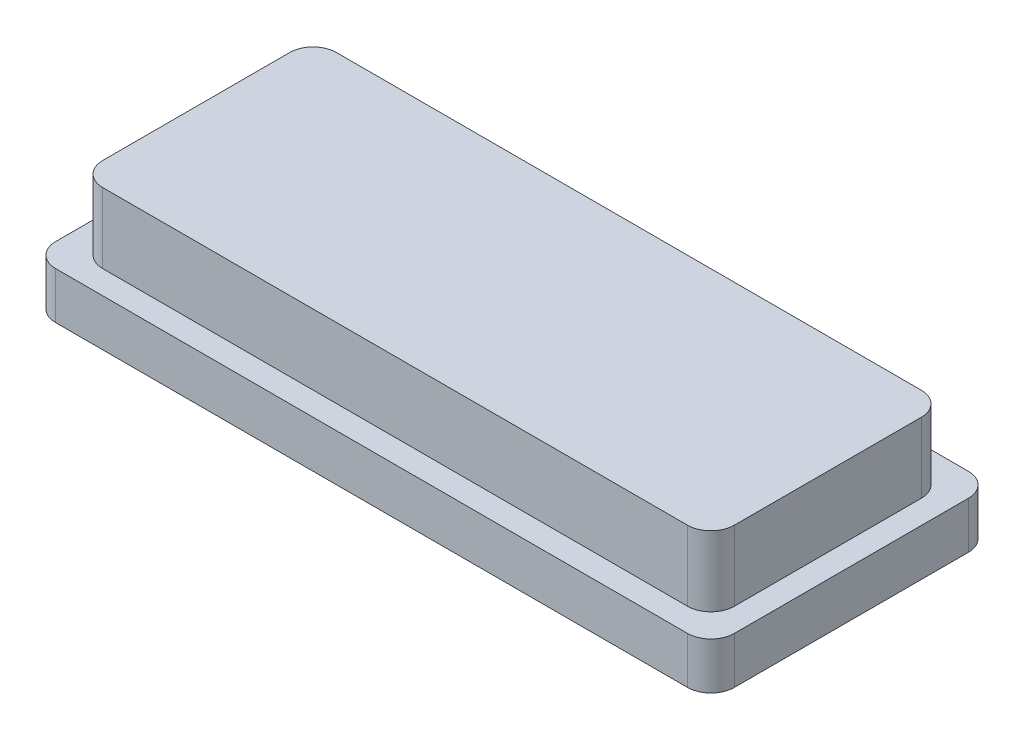
ISO-10303-21;
HEADER;
FILE_DESCRIPTION(('STEP AP214'),'2;1');
FILE_NAME('part.step','',(''),(''),'','','');
FILE_SCHEMA(('AUTOMOTIVE_DESIGN { 1 0 10303 214 1 1 1 1 }'));
ENDSEC;
DATA;
#1=APPLICATION_CONTEXT('core data for automotive mechanical design processes');
#2=APPLICATION_PROTOCOL_DEFINITION('international standard','automotive_design',2000,#1);
#3=PRODUCT_CONTEXT('',#1,'mechanical');
#4=PRODUCT('Part','Part','',(#3));
#5=PRODUCT_RELATED_PRODUCT_CATEGORY('part','',(#4));
#6=PRODUCT_DEFINITION_FORMATION('','',#4);
#7=PRODUCT_DEFINITION_CONTEXT('part definition',#1,'design');
#8=PRODUCT_DEFINITION('design','',#6,#7);
#9=PRODUCT_DEFINITION_SHAPE('','',#8);
#10=(LENGTH_UNIT() NAMED_UNIT(*) SI_UNIT(.MILLI.,.METRE.));
#11=(NAMED_UNIT(*) PLANE_ANGLE_UNIT() SI_UNIT($,.RADIAN.));
#12=(NAMED_UNIT(*) SI_UNIT($,.STERADIAN.) SOLID_ANGLE_UNIT());
#13=UNCERTAINTY_MEASURE_WITH_UNIT(LENGTH_MEASURE(1.E-05),#10,'distance_accuracy_value','');
#14=(GEOMETRIC_REPRESENTATION_CONTEXT(3) GLOBAL_UNCERTAINTY_ASSIGNED_CONTEXT((#13)) GLOBAL_UNIT_ASSIGNED_CONTEXT((#10,
#11,#12)) REPRESENTATION_CONTEXT('',''));
#15=CARTESIAN_POINT('',(0.,0.,0.));
#16=DIRECTION('',(0.,0.,1.));
#17=DIRECTION('',(1.,0.,0.));
#18=AXIS2_PLACEMENT_3D('',#15,#16,#17);
#19=CARTESIAN_POINT('',(13.5,2.,-5.));
#20=DIRECTION('',(0.,1.,0.));
#21=DIRECTION('',(0.,0.,1.));
#22=AXIS2_PLACEMENT_3D('',#19,#20,#21);
#23=PLANE('',#22);
#24=CARTESIAN_POINT('',(13.5,2.,-5.));
#25=DIRECTION('',(0.,1.,0.));
#26=DIRECTION('',(0.,0.,1.));
#27=AXIS2_PLACEMENT_3D('',#24,#25,#26);
#28=CIRCLE('',#27,1.);
#29=CARTESIAN_POINT('',(14.5,2.,-4.99999999999999));
#30=VERTEX_POINT('',#29);
#31=CARTESIAN_POINT('',(13.5,2.,-6.));
#32=VERTEX_POINT('',#31);
#33=EDGE_CURVE('E216',#30,#32,#28,.T.);
#34=ORIENTED_EDGE('',*,*,#33,.T.);
#35=DIRECTION('',(-1.,0.,0.));
#36=VECTOR('',#35,1.);
#37=CARTESIAN_POINT('',(-13.5,2.,-6.));
#38=LINE('',#37,#36);
#39=CARTESIAN_POINT('',(-13.5,2.,-6.));
#40=VERTEX_POINT('',#39);
#41=EDGE_CURVE('E219',#32,#40,#38,.T.);
#42=ORIENTED_EDGE('',*,*,#41,.T.);
#43=CARTESIAN_POINT('',(-13.5,2.,-5.));
#44=DIRECTION('',(0.,1.,0.));
#45=DIRECTION('',(0.,0.,-1.));
#46=AXIS2_PLACEMENT_3D('',#43,#44,#45);
#47=CIRCLE('',#46,1.);
#48=CARTESIAN_POINT('',(-14.5,2.,-4.99999999999999));
#49=VERTEX_POINT('',#48);
#50=EDGE_CURVE('E222',#40,#49,#47,.T.);
#51=ORIENTED_EDGE('',*,*,#50,.T.);
#52=DIRECTION('',(0.,0.,1.));
#53=VECTOR('',#52,1.);
#54=CARTESIAN_POINT('',(-14.5,2.,-4.99999999999999));
#55=LINE('',#54,#53);
#56=CARTESIAN_POINT('',(-14.5,2.,4.99999999999999));
#57=VERTEX_POINT('',#56);
#58=EDGE_CURVE('E224',#49,#57,#55,.T.);
#59=ORIENTED_EDGE('',*,*,#58,.T.);
#60=CARTESIAN_POINT('',(-13.5,2.,5.));
#61=DIRECTION('',(0.,1.,0.));
#62=DIRECTION('',(0.,0.,-1.));
#63=AXIS2_PLACEMENT_3D('',#60,#61,#62);
#64=CIRCLE('',#63,1.);
#65=CARTESIAN_POINT('',(-13.5,2.,6.));
#66=VERTEX_POINT('',#65);
#67=EDGE_CURVE('E226',#57,#66,#64,.T.);
#68=ORIENTED_EDGE('',*,*,#67,.T.);
#69=DIRECTION('',(1.,0.,0.));
#70=VECTOR('',#69,1.);
#71=CARTESIAN_POINT('',(-13.5,2.,6.));
#72=LINE('',#71,#70);
#73=CARTESIAN_POINT('',(13.5,2.,6.));
#74=VERTEX_POINT('',#73);
#75=EDGE_CURVE('E228',#66,#74,#72,.T.);
#76=ORIENTED_EDGE('',*,*,#75,.T.);
#77=CARTESIAN_POINT('',(13.5,2.,5.));
#78=DIRECTION('',(0.,1.,0.));
#79=DIRECTION('',(0.,0.,1.));
#80=AXIS2_PLACEMENT_3D('',#77,#78,#79);
#81=CIRCLE('',#80,1.);
#82=CARTESIAN_POINT('',(14.5,2.,4.99999999999999));
#83=VERTEX_POINT('',#82);
#84=EDGE_CURVE('E230',#74,#83,#81,.T.);
#85=ORIENTED_EDGE('',*,*,#84,.T.);
#86=DIRECTION('',(0.,0.,-1.));
#87=VECTOR('',#86,1.);
#88=CARTESIAN_POINT('',(14.5,2.,-4.99999999999999));
#89=LINE('',#88,#87);
#90=EDGE_CURVE('E232',#83,#30,#89,.T.);
#91=ORIENTED_EDGE('',*,*,#90,.T.);
#92=EDGE_LOOP('',(#34,#42,#51,#59,#68,#76,#85,#91));
#93=FACE_BOUND('',#92,.T.);
#94=CARTESIAN_POINT('',(12.495,2.,-3.995));
#95=DIRECTION('',(0.,1.,0.));
#96=DIRECTION('',(0.,0.,1.));
#97=AXIS2_PLACEMENT_3D('',#94,#95,#96);
#98=CIRCLE('',#97,1.);
#99=CARTESIAN_POINT('',(13.495,2.,-3.99499999999999));
#100=VERTEX_POINT('',#99);
#101=CARTESIAN_POINT('',(12.495,2.,-4.995));
#102=VERTEX_POINT('',#101);
#103=EDGE_CURVE('E167',#100,#102,#98,.T.);
#104=ORIENTED_EDGE('',*,*,#103,.F.);
#105=DIRECTION('',(0.,0.,1.));
#106=VECTOR('',#105,1.);
#107=CARTESIAN_POINT('',(13.495,2.,-3.99499999999999));
#108=LINE('',#107,#106);
#109=CARTESIAN_POINT('',(13.495,2.,3.99499999999999));
#110=VERTEX_POINT('',#109);
#111=EDGE_CURVE('E48',#100,#110,#108,.T.);
#112=ORIENTED_EDGE('',*,*,#111,.T.);
#113=CARTESIAN_POINT('',(12.495,2.,3.995));
#114=DIRECTION('',(0.,1.,0.));
#115=DIRECTION('',(0.,0.,1.));
#116=AXIS2_PLACEMENT_3D('',#113,#114,#115);
#117=CIRCLE('',#116,1.);
#118=CARTESIAN_POINT('',(12.495,2.,4.995));
#119=VERTEX_POINT('',#118);
#120=EDGE_CURVE('E53',#119,#110,#117,.T.);
#121=ORIENTED_EDGE('',*,*,#120,.F.);
#122=DIRECTION('',(1.,0.,0.));
#123=VECTOR('',#122,1.);
#124=CARTESIAN_POINT('',(-12.495,2.,4.995));
#125=LINE('',#124,#123);
#126=CARTESIAN_POINT('',(-12.495,2.,4.995));
#127=VERTEX_POINT('',#126);
#128=EDGE_CURVE('E188',#127,#119,#125,.T.);
#129=ORIENTED_EDGE('',*,*,#128,.F.);
#130=CARTESIAN_POINT('',(-12.495,2.,3.995));
#131=DIRECTION('',(0.,-1.,0.));
#132=DIRECTION('',(0.,0.,-1.));
#133=AXIS2_PLACEMENT_3D('',#130,#131,#132);
#134=CIRCLE('',#133,1.);
#135=CARTESIAN_POINT('',(-13.495,2.,3.99499999999999));
#136=VERTEX_POINT('',#135);
#137=EDGE_CURVE('E190',#127,#136,#134,.T.);
#138=ORIENTED_EDGE('',*,*,#137,.T.);
#139=DIRECTION('',(0.,0.,1.));
#140=VECTOR('',#139,1.);
#141=CARTESIAN_POINT('',(-13.495,2.,-3.99499999999999));
#142=LINE('',#141,#140);
#143=CARTESIAN_POINT('',(-13.495,2.,-3.99499999999999));
#144=VERTEX_POINT('',#143);
#145=EDGE_CURVE('E192',#144,#136,#142,.T.);
#146=ORIENTED_EDGE('',*,*,#145,.F.);
#147=CARTESIAN_POINT('',(-12.495,2.,-3.995));
#148=DIRECTION('',(0.,-1.,0.));
#149=DIRECTION('',(0.,0.,-1.));
#150=AXIS2_PLACEMENT_3D('',#147,#148,#149);
#151=CIRCLE('',#150,1.);
#152=CARTESIAN_POINT('',(-12.495,2.,-4.995));
#153=VERTEX_POINT('',#152);
#154=EDGE_CURVE('E195',#144,#153,#151,.T.);
#155=ORIENTED_EDGE('',*,*,#154,.T.);
#156=DIRECTION('',(1.,0.,0.));
#157=VECTOR('',#156,1.);
#158=CARTESIAN_POINT('',(-12.495,2.,-4.995));
#159=LINE('',#158,#157);
#160=EDGE_CURVE('E170',#153,#102,#159,.T.);
#161=ORIENTED_EDGE('',*,*,#160,.T.);
#162=EDGE_LOOP('',(#104,#112,#121,#129,#138,#146,#155,#161));
#163=FACE_BOUND('',#162,.T.);
#164=ADVANCED_FACE('F33',(#93,#163),#23,.T.);
#165=CARTESIAN_POINT('',(13.5,2.,-5.));
#166=DIRECTION('',(0.,-1.,0.));
#167=DIRECTION('',(0.,0.,-1.));
#168=AXIS2_PLACEMENT_3D('',#165,#166,#167);
#169=CYLINDRICAL_SURFACE('',#168,1.);
#170=CARTESIAN_POINT('',(13.5,0.,-5.));
#171=DIRECTION('',(0.,1.,0.));
#172=DIRECTION('',(0.,0.,1.));
#173=AXIS2_PLACEMENT_3D('',#170,#171,#172);
#174=CIRCLE('',#173,1.);
#175=CARTESIAN_POINT('',(14.5,0.,-4.99999999999999));
#176=VERTEX_POINT('',#175);
#177=CARTESIAN_POINT('',(13.5,0.,-6.));
#178=VERTEX_POINT('',#177);
#179=EDGE_CURVE('E199',#176,#178,#174,.T.);
#180=ORIENTED_EDGE('',*,*,#179,.T.);
#181=DIRECTION('',(0.,-1.,0.));
#182=VECTOR('',#181,1.);
#183=CARTESIAN_POINT('',(13.5,2.,-6.));
#184=LINE('',#183,#182);
#185=EDGE_CURVE('E11',#32,#178,#184,.T.);
#186=ORIENTED_EDGE('',*,*,#185,.F.);
#187=ORIENTED_EDGE('',*,*,#33,.F.);
#188=DIRECTION('',(0.,-1.,0.));
#189=VECTOR('',#188,1.);
#190=CARTESIAN_POINT('',(14.5,2.,-4.99999999999999));
#191=LINE('',#190,#189);
#192=EDGE_CURVE('E234',#30,#176,#191,.T.);
#193=ORIENTED_EDGE('',*,*,#192,.T.);
#194=EDGE_LOOP('',(#180,#186,#187,#193));
#195=FACE_BOUND('',#194,.T.);
#196=ADVANCED_FACE('F35',(#195),#169,.T.);
#197=CARTESIAN_POINT('',(-13.5,2.,-6.));
#198=DIRECTION('',(0.,0.,1.));
#199=DIRECTION('',(1.,0.,0.));
#200=AXIS2_PLACEMENT_3D('',#197,#198,#199);
#201=PLANE('',#200);
#202=DIRECTION('',(-1.,0.,0.));
#203=VECTOR('',#202,1.);
#204=CARTESIAN_POINT('',(-13.5,0.,-6.));
#205=LINE('',#204,#203);
#206=CARTESIAN_POINT('',(-13.5,0.,-6.));
#207=VERTEX_POINT('',#206);
#208=EDGE_CURVE('E237',#178,#207,#205,.T.);
#209=ORIENTED_EDGE('',*,*,#208,.T.);
#210=DIRECTION('',(0.,-1.,0.));
#211=VECTOR('',#210,1.);
#212=CARTESIAN_POINT('',(-13.5,2.,-6.));
#213=LINE('',#212,#211);
#214=EDGE_CURVE('E41',#40,#207,#213,.T.);
#215=ORIENTED_EDGE('',*,*,#214,.F.);
#216=ORIENTED_EDGE('',*,*,#41,.F.);
#217=ORIENTED_EDGE('',*,*,#185,.T.);
#218=EDGE_LOOP('',(#209,#215,#216,#217));
#219=FACE_BOUND('',#218,.T.);
#220=ADVANCED_FACE('F293',(#219),#201,.F.);
#221=CARTESIAN_POINT('',(-13.5,2.,-5.));
#222=DIRECTION('',(0.,-1.,0.));
#223=DIRECTION('',(0.,0.,-1.));
#224=AXIS2_PLACEMENT_3D('',#221,#222,#223);
#225=CYLINDRICAL_SURFACE('',#224,1.);
#226=CARTESIAN_POINT('',(-13.5,0.,-5.));
#227=DIRECTION('',(0.,1.,0.));
#228=DIRECTION('',(0.,0.,-1.));
#229=AXIS2_PLACEMENT_3D('',#226,#227,#228);
#230=CIRCLE('',#229,1.);
#231=CARTESIAN_POINT('',(-14.5,0.,-4.99999999999999));
#232=VERTEX_POINT('',#231);
#233=EDGE_CURVE('E239',#207,#232,#230,.T.);
#234=ORIENTED_EDGE('',*,*,#233,.T.);
#235=DIRECTION('',(0.,-1.,0.));
#236=VECTOR('',#235,1.);
#237=CARTESIAN_POINT('',(-14.5,2.,-4.99999999999999));
#238=LINE('',#237,#236);
#239=EDGE_CURVE('E264',#49,#232,#238,.T.);
#240=ORIENTED_EDGE('',*,*,#239,.F.);
#241=ORIENTED_EDGE('',*,*,#50,.F.);
#242=ORIENTED_EDGE('',*,*,#214,.T.);
#243=EDGE_LOOP('',(#234,#240,#241,#242));
#244=FACE_BOUND('',#243,.T.);
#245=ADVANCED_FACE('F271',(#244),#225,.T.);
#246=CARTESIAN_POINT('',(-14.5,2.,-4.99999999999999));
#247=DIRECTION('',(1.,0.,0.));
#248=DIRECTION('',(0.,0.,-1.));
#249=AXIS2_PLACEMENT_3D('',#246,#247,#248);
#250=PLANE('',#249);
#251=DIRECTION('',(0.,0.,1.));
#252=VECTOR('',#251,1.);
#253=CARTESIAN_POINT('',(-14.5,0.,-4.99999999999999));
#254=LINE('',#253,#252);
#255=CARTESIAN_POINT('',(-14.5,0.,4.99999999999999));
#256=VERTEX_POINT('',#255);
#257=EDGE_CURVE('E241',#232,#256,#254,.T.);
#258=ORIENTED_EDGE('',*,*,#257,.T.);
#259=DIRECTION('',(0.,-1.,0.));
#260=VECTOR('',#259,1.);
#261=CARTESIAN_POINT('',(-14.5,2.,4.99999999999999));
#262=LINE('',#261,#260);
#263=EDGE_CURVE('E261',#57,#256,#262,.T.);
#264=ORIENTED_EDGE('',*,*,#263,.F.);
#265=ORIENTED_EDGE('',*,*,#58,.F.);
#266=ORIENTED_EDGE('',*,*,#239,.T.);
#267=EDGE_LOOP('',(#258,#264,#265,#266));
#268=FACE_BOUND('',#267,.T.);
#269=ADVANCED_FACE('F282',(#268),#250,.F.);
#270=CARTESIAN_POINT('',(-13.5,2.,5.));
#271=DIRECTION('',(0.,-1.,0.));
#272=DIRECTION('',(0.,0.,-1.));
#273=AXIS2_PLACEMENT_3D('',#270,#271,#272);
#274=CYLINDRICAL_SURFACE('',#273,1.);
#275=CARTESIAN_POINT('',(-13.5,0.,5.));
#276=DIRECTION('',(0.,1.,0.));
#277=DIRECTION('',(0.,0.,-1.));
#278=AXIS2_PLACEMENT_3D('',#275,#276,#277);
#279=CIRCLE('',#278,1.);
#280=CARTESIAN_POINT('',(-13.5,0.,6.));
#281=VERTEX_POINT('',#280);
#282=EDGE_CURVE('E243',#256,#281,#279,.T.);
#283=ORIENTED_EDGE('',*,*,#282,.T.);
#284=DIRECTION('',(0.,-1.,0.));
#285=VECTOR('',#284,1.);
#286=CARTESIAN_POINT('',(-13.5,2.,6.));
#287=LINE('',#286,#285);
#288=EDGE_CURVE('E258',#66,#281,#287,.T.);
#289=ORIENTED_EDGE('',*,*,#288,.F.);
#290=ORIENTED_EDGE('',*,*,#67,.F.);
#291=ORIENTED_EDGE('',*,*,#263,.T.);
#292=EDGE_LOOP('',(#283,#289,#290,#291));
#293=FACE_BOUND('',#292,.T.);
#294=ADVANCED_FACE('F286',(#293),#274,.T.);
#295=CARTESIAN_POINT('',(-13.5,2.,6.));
#296=DIRECTION('',(0.,0.,-1.));
#297=DIRECTION('',(-1.,0.,0.));
#298=AXIS2_PLACEMENT_3D('',#295,#296,#297);
#299=PLANE('',#298);
#300=DIRECTION('',(1.,0.,0.));
#301=VECTOR('',#300,1.);
#302=CARTESIAN_POINT('',(-13.5,0.,6.));
#303=LINE('',#302,#301);
#304=CARTESIAN_POINT('',(13.5,0.,6.));
#305=VERTEX_POINT('',#304);
#306=EDGE_CURVE('E245',#281,#305,#303,.T.);
#307=ORIENTED_EDGE('',*,*,#306,.T.);
#308=DIRECTION('',(0.,-1.,0.));
#309=VECTOR('',#308,1.);
#310=CARTESIAN_POINT('',(13.5,2.,6.));
#311=LINE('',#310,#309);
#312=EDGE_CURVE('E255',#74,#305,#311,.T.);
#313=ORIENTED_EDGE('',*,*,#312,.F.);
#314=ORIENTED_EDGE('',*,*,#75,.F.);
#315=ORIENTED_EDGE('',*,*,#288,.T.);
#316=EDGE_LOOP('',(#307,#313,#314,#315));
#317=FACE_BOUND('',#316,.T.);
#318=ADVANCED_FACE('F306',(#317),#299,.F.);
#319=CARTESIAN_POINT('',(13.5,2.,5.));
#320=DIRECTION('',(0.,-1.,0.));
#321=DIRECTION('',(0.,0.,-1.));
#322=AXIS2_PLACEMENT_3D('',#319,#320,#321);
#323=CYLINDRICAL_SURFACE('',#322,1.);
#324=CARTESIAN_POINT('',(13.5,0.,5.));
#325=DIRECTION('',(0.,1.,0.));
#326=DIRECTION('',(0.,0.,1.));
#327=AXIS2_PLACEMENT_3D('',#324,#325,#326);
#328=CIRCLE('',#327,1.);
#329=CARTESIAN_POINT('',(14.5,0.,4.99999999999999));
#330=VERTEX_POINT('',#329);
#331=EDGE_CURVE('E247',#305,#330,#328,.T.);
#332=ORIENTED_EDGE('',*,*,#331,.T.);
#333=DIRECTION('',(0.,-1.,0.));
#334=VECTOR('',#333,1.);
#335=CARTESIAN_POINT('',(14.5,2.,4.99999999999999));
#336=LINE('',#335,#334);
#337=EDGE_CURVE('E252',#83,#330,#336,.T.);
#338=ORIENTED_EDGE('',*,*,#337,.F.);
#339=ORIENTED_EDGE('',*,*,#84,.F.);
#340=ORIENTED_EDGE('',*,*,#312,.T.);
#341=EDGE_LOOP('',(#332,#338,#339,#340));
#342=FACE_BOUND('',#341,.T.);
#343=ADVANCED_FACE('F304',(#342),#323,.T.);
#344=CARTESIAN_POINT('',(14.5,2.,-4.99999999999999));
#345=DIRECTION('',(-1.,0.,0.));
#346=DIRECTION('',(0.,0.,1.));
#347=AXIS2_PLACEMENT_3D('',#344,#345,#346);
#348=PLANE('',#347);
#349=DIRECTION('',(0.,0.,-1.));
#350=VECTOR('',#349,1.);
#351=CARTESIAN_POINT('',(14.5,0.,-4.99999999999999));
#352=LINE('',#351,#350);
#353=EDGE_CURVE('E220',#330,#176,#352,.T.);
#354=ORIENTED_EDGE('',*,*,#353,.T.);
#355=ORIENTED_EDGE('',*,*,#192,.F.);
#356=ORIENTED_EDGE('',*,*,#90,.F.);
#357=ORIENTED_EDGE('',*,*,#337,.T.);
#358=EDGE_LOOP('',(#354,#355,#356,#357));
#359=FACE_BOUND('',#358,.T.);
#360=ADVANCED_FACE('F299',(#359),#348,.F.);
#361=CARTESIAN_POINT('',(13.5,0.,-5.));
#362=DIRECTION('',(0.,1.,0.));
#363=DIRECTION('',(0.,0.,1.));
#364=AXIS2_PLACEMENT_3D('',#361,#362,#363);
#365=PLANE('',#364);
#366=ORIENTED_EDGE('',*,*,#179,.F.);
#367=ORIENTED_EDGE('',*,*,#353,.F.);
#368=ORIENTED_EDGE('',*,*,#331,.F.);
#369=ORIENTED_EDGE('',*,*,#306,.F.);
#370=ORIENTED_EDGE('',*,*,#282,.F.);
#371=ORIENTED_EDGE('',*,*,#257,.F.);
#372=ORIENTED_EDGE('',*,*,#233,.F.);
#373=ORIENTED_EDGE('',*,*,#208,.F.);
#374=EDGE_LOOP('',(#366,#367,#368,#369,#370,#371,#372,#373));
#375=FACE_BOUND('',#374,.T.);
#376=ADVANCED_FACE('F277',(#375),#365,.F.);
#377=CARTESIAN_POINT('',(13.495,5.,-3.99499999999999));
#378=DIRECTION('',(1.,0.,0.));
#379=DIRECTION('',(0.,0.,-1.));
#380=AXIS2_PLACEMENT_3D('',#377,#378,#379);
#381=PLANE('',#380);
#382=ORIENTED_EDGE('',*,*,#111,.F.);
#383=DIRECTION('',(0.,-1.,0.));
#384=VECTOR('',#383,1.);
#385=CARTESIAN_POINT('',(13.495,5.,-3.99499999999999));
#386=LINE('',#385,#384);
#387=CARTESIAN_POINT('',(13.495,5.,-3.99499999999999));
#388=VERTEX_POINT('',#387);
#389=EDGE_CURVE('E165',#388,#100,#386,.T.);
#390=ORIENTED_EDGE('',*,*,#389,.F.);
#391=DIRECTION('',(0.,0.,1.));
#392=VECTOR('',#391,1.);
#393=CARTESIAN_POINT('',(13.495,5.,-3.99499999999999));
#394=LINE('',#393,#392);
#395=CARTESIAN_POINT('',(13.495,5.,3.99499999999999));
#396=VERTEX_POINT('',#395);
#397=EDGE_CURVE('E149',#388,#396,#394,.T.);
#398=ORIENTED_EDGE('',*,*,#397,.T.);
#399=DIRECTION('',(0.,-1.,0.));
#400=VECTOR('',#399,1.);
#401=CARTESIAN_POINT('',(13.495,5.,3.99499999999999));
#402=LINE('',#401,#400);
#403=EDGE_CURVE('E157',#396,#110,#402,.T.);
#404=ORIENTED_EDGE('',*,*,#403,.T.);
#405=EDGE_LOOP('',(#382,#390,#398,#404));
#406=FACE_BOUND('',#405,.T.);
#407=ADVANCED_FACE('F163',(#406),#381,.T.);
#408=CARTESIAN_POINT('',(12.495,5.,-3.995));
#409=DIRECTION('',(0.,-1.,0.));
#410=DIRECTION('',(0.,0.,-1.));
#411=AXIS2_PLACEMENT_3D('',#408,#409,#410);
#412=CYLINDRICAL_SURFACE('',#411,1.);
#413=ORIENTED_EDGE('',*,*,#103,.T.);
#414=DIRECTION('',(0.,-1.,0.));
#415=VECTOR('',#414,1.);
#416=CARTESIAN_POINT('',(12.495,5.,-4.995));
#417=LINE('',#416,#415);
#418=CARTESIAN_POINT('',(12.495,5.,-4.995));
#419=VERTEX_POINT('',#418);
#420=EDGE_CURVE('E200',#419,#102,#417,.T.);
#421=ORIENTED_EDGE('',*,*,#420,.F.);
#422=CARTESIAN_POINT('',(12.495,5.,-3.995));
#423=DIRECTION('',(0.,1.,0.));
#424=DIRECTION('',(0.,0.,1.));
#425=AXIS2_PLACEMENT_3D('',#422,#423,#424);
#426=CIRCLE('',#425,1.);
#427=EDGE_CURVE('E161',#388,#419,#426,.T.);
#428=ORIENTED_EDGE('',*,*,#427,.F.);
#429=ORIENTED_EDGE('',*,*,#389,.T.);
#430=EDGE_LOOP('',(#413,#421,#428,#429));
#431=FACE_BOUND('',#430,.T.);
#432=ADVANCED_FACE('F340',(#431),#412,.T.);
#433=CARTESIAN_POINT('',(-12.495,5.,-4.995));
#434=DIRECTION('',(0.,0.,-1.));
#435=DIRECTION('',(-1.,0.,0.));
#436=AXIS2_PLACEMENT_3D('',#433,#434,#435);
#437=PLANE('',#436);
#438=ORIENTED_EDGE('',*,*,#160,.F.);
#439=DIRECTION('',(0.,-1.,0.));
#440=VECTOR('',#439,1.);
#441=CARTESIAN_POINT('',(-12.495,5.,-4.995));
#442=LINE('',#441,#440);
#443=CARTESIAN_POINT('',(-12.495,5.,-4.995));
#444=VERTEX_POINT('',#443);
#445=EDGE_CURVE('E203',#444,#153,#442,.T.);
#446=ORIENTED_EDGE('',*,*,#445,.F.);
#447=DIRECTION('',(1.,0.,0.));
#448=VECTOR('',#447,1.);
#449=CARTESIAN_POINT('',(-12.495,5.,-4.995));
#450=LINE('',#449,#448);
#451=EDGE_CURVE('E182',#444,#419,#450,.T.);
#452=ORIENTED_EDGE('',*,*,#451,.T.);
#453=ORIENTED_EDGE('',*,*,#420,.T.);
#454=EDGE_LOOP('',(#438,#446,#452,#453));
#455=FACE_BOUND('',#454,.T.);
#456=ADVANCED_FACE('F346',(#455),#437,.T.);
#457=CARTESIAN_POINT('',(-12.495,5.,-3.995));
#458=DIRECTION('',(0.,-1.,0.));
#459=DIRECTION('',(0.,0.,-1.));
#460=AXIS2_PLACEMENT_3D('',#457,#458,#459);
#461=CYLINDRICAL_SURFACE('',#460,1.);
#462=ORIENTED_EDGE('',*,*,#154,.F.);
#463=DIRECTION('',(0.,-1.,0.));
#464=VECTOR('',#463,1.);
#465=CARTESIAN_POINT('',(-13.495,5.,-3.99499999999999));
#466=LINE('',#465,#464);
#467=CARTESIAN_POINT('',(-13.495,5.,-3.99499999999999));
#468=VERTEX_POINT('',#467);
#469=EDGE_CURVE('E206',#468,#144,#466,.T.);
#470=ORIENTED_EDGE('',*,*,#469,.F.);
#471=CARTESIAN_POINT('',(-12.495,5.,-3.995));
#472=DIRECTION('',(0.,-1.,0.));
#473=DIRECTION('',(0.,0.,-1.));
#474=AXIS2_PLACEMENT_3D('',#471,#472,#473);
#475=CIRCLE('',#474,1.);
#476=EDGE_CURVE('E179',#468,#444,#475,.T.);
#477=ORIENTED_EDGE('',*,*,#476,.T.);
#478=ORIENTED_EDGE('',*,*,#445,.T.);
#479=EDGE_LOOP('',(#462,#470,#477,#478));
#480=FACE_BOUND('',#479,.T.);
#481=ADVANCED_FACE('F354',(#480),#461,.T.);
#482=CARTESIAN_POINT('',(-13.495,5.,-3.99499999999999));
#483=DIRECTION('',(1.,0.,0.));
#484=DIRECTION('',(0.,0.,-1.));
#485=AXIS2_PLACEMENT_3D('',#482,#483,#484);
#486=PLANE('',#485);
#487=ORIENTED_EDGE('',*,*,#145,.T.);
#488=DIRECTION('',(0.,-1.,0.));
#489=VECTOR('',#488,1.);
#490=CARTESIAN_POINT('',(-13.495,5.,3.99499999999999));
#491=LINE('',#490,#489);
#492=CARTESIAN_POINT('',(-13.495,5.,3.99499999999999));
#493=VERTEX_POINT('',#492);
#494=EDGE_CURVE('E209',#493,#136,#491,.T.);
#495=ORIENTED_EDGE('',*,*,#494,.F.);
#496=DIRECTION('',(0.,0.,1.));
#497=VECTOR('',#496,1.);
#498=CARTESIAN_POINT('',(-13.495,5.,-3.99499999999999));
#499=LINE('',#498,#497);
#500=EDGE_CURVE('E177',#468,#493,#499,.T.);
#501=ORIENTED_EDGE('',*,*,#500,.F.);
#502=ORIENTED_EDGE('',*,*,#469,.T.);
#503=EDGE_LOOP('',(#487,#495,#501,#502));
#504=FACE_BOUND('',#503,.T.);
#505=ADVANCED_FACE('F362',(#504),#486,.F.);
#506=CARTESIAN_POINT('',(-12.495,5.,3.995));
#507=DIRECTION('',(0.,-1.,0.));
#508=DIRECTION('',(0.,0.,-1.));
#509=AXIS2_PLACEMENT_3D('',#506,#507,#508);
#510=CYLINDRICAL_SURFACE('',#509,1.);
#511=ORIENTED_EDGE('',*,*,#137,.F.);
#512=DIRECTION('',(0.,-1.,0.));
#513=VECTOR('',#512,1.);
#514=CARTESIAN_POINT('',(-12.495,5.,4.995));
#515=LINE('',#514,#513);
#516=CARTESIAN_POINT('',(-12.495,5.,4.995));
#517=VERTEX_POINT('',#516);
#518=EDGE_CURVE('E212',#517,#127,#515,.T.);
#519=ORIENTED_EDGE('',*,*,#518,.F.);
#520=CARTESIAN_POINT('',(-12.495,5.,3.995));
#521=DIRECTION('',(0.,-1.,0.));
#522=DIRECTION('',(0.,0.,-1.));
#523=AXIS2_PLACEMENT_3D('',#520,#521,#522);
#524=CIRCLE('',#523,1.);
#525=EDGE_CURVE('E174',#517,#493,#524,.T.);
#526=ORIENTED_EDGE('',*,*,#525,.T.);
#527=ORIENTED_EDGE('',*,*,#494,.T.);
#528=EDGE_LOOP('',(#511,#519,#526,#527));
#529=FACE_BOUND('',#528,.T.);
#530=ADVANCED_FACE('F370',(#529),#510,.T.);
#531=CARTESIAN_POINT('',(-12.495,5.,4.995));
#532=DIRECTION('',(0.,0.,-1.));
#533=DIRECTION('',(-1.,0.,0.));
#534=AXIS2_PLACEMENT_3D('',#531,#532,#533);
#535=PLANE('',#534);
#536=ORIENTED_EDGE('',*,*,#128,.T.);
#537=DIRECTION('',(0.,-1.,0.));
#538=VECTOR('',#537,1.);
#539=CARTESIAN_POINT('',(12.495,5.,4.995));
#540=LINE('',#539,#538);
#541=CARTESIAN_POINT('',(12.495,5.,4.995));
#542=VERTEX_POINT('',#541);
#543=EDGE_CURVE('E160',#542,#119,#540,.T.);
#544=ORIENTED_EDGE('',*,*,#543,.F.);
#545=DIRECTION('',(1.,0.,0.));
#546=VECTOR('',#545,1.);
#547=CARTESIAN_POINT('',(-12.495,5.,4.995));
#548=LINE('',#547,#546);
#549=EDGE_CURVE('E152',#517,#542,#548,.T.);
#550=ORIENTED_EDGE('',*,*,#549,.F.);
#551=ORIENTED_EDGE('',*,*,#518,.T.);
#552=EDGE_LOOP('',(#536,#544,#550,#551));
#553=FACE_BOUND('',#552,.T.);
#554=ADVANCED_FACE('F378',(#553),#535,.F.);
#555=CARTESIAN_POINT('',(12.495,5.,3.995));
#556=DIRECTION('',(0.,-1.,0.));
#557=DIRECTION('',(0.,0.,-1.));
#558=AXIS2_PLACEMENT_3D('',#555,#556,#557);
#559=CYLINDRICAL_SURFACE('',#558,1.);
#560=ORIENTED_EDGE('',*,*,#120,.T.);
#561=ORIENTED_EDGE('',*,*,#403,.F.);
#562=CARTESIAN_POINT('',(12.495,5.,3.995));
#563=DIRECTION('',(0.,1.,0.));
#564=DIRECTION('',(0.,0.,1.));
#565=AXIS2_PLACEMENT_3D('',#562,#563,#564);
#566=CIRCLE('',#565,1.);
#567=EDGE_CURVE('E145',#542,#396,#566,.T.);
#568=ORIENTED_EDGE('',*,*,#567,.F.);
#569=ORIENTED_EDGE('',*,*,#543,.T.);
#570=EDGE_LOOP('',(#560,#561,#568,#569));
#571=FACE_BOUND('',#570,.T.);
#572=ADVANCED_FACE('F158',(#571),#559,.T.);
#573=CARTESIAN_POINT('',(12.495,5.,3.995));
#574=DIRECTION('',(0.,1.,0.));
#575=DIRECTION('',(0.,0.,1.));
#576=AXIS2_PLACEMENT_3D('',#573,#574,#575);
#577=PLANE('',#576);
#578=ORIENTED_EDGE('',*,*,#397,.F.);
#579=ORIENTED_EDGE('',*,*,#427,.T.);
#580=ORIENTED_EDGE('',*,*,#451,.F.);
#581=ORIENTED_EDGE('',*,*,#476,.F.);
#582=ORIENTED_EDGE('',*,*,#500,.T.);
#583=ORIENTED_EDGE('',*,*,#525,.F.);
#584=ORIENTED_EDGE('',*,*,#549,.T.);
#585=ORIENTED_EDGE('',*,*,#567,.T.);
#586=EDGE_LOOP('',(#578,#579,#580,#581,#582,#583,#584,#585));
#587=FACE_BOUND('',#586,.T.);
#588=ADVANCED_FACE('F147',(#587),#577,.T.);
#589=CLOSED_SHELL('',(#164,#196,#220,#245,#269,#294,#318,#343,#360,#376,#407,#432,#456,#481,
#505,#530,#554,#572,#588));
#590=MANIFOLD_SOLID_BREP('B2',#589);
#591=ADVANCED_BREP_SHAPE_REPRESENTATION('',(#18,#590),#14);
#592=SHAPE_DEFINITION_REPRESENTATION(#9,#591);
ENDSEC;
END-ISO-10303-21;
